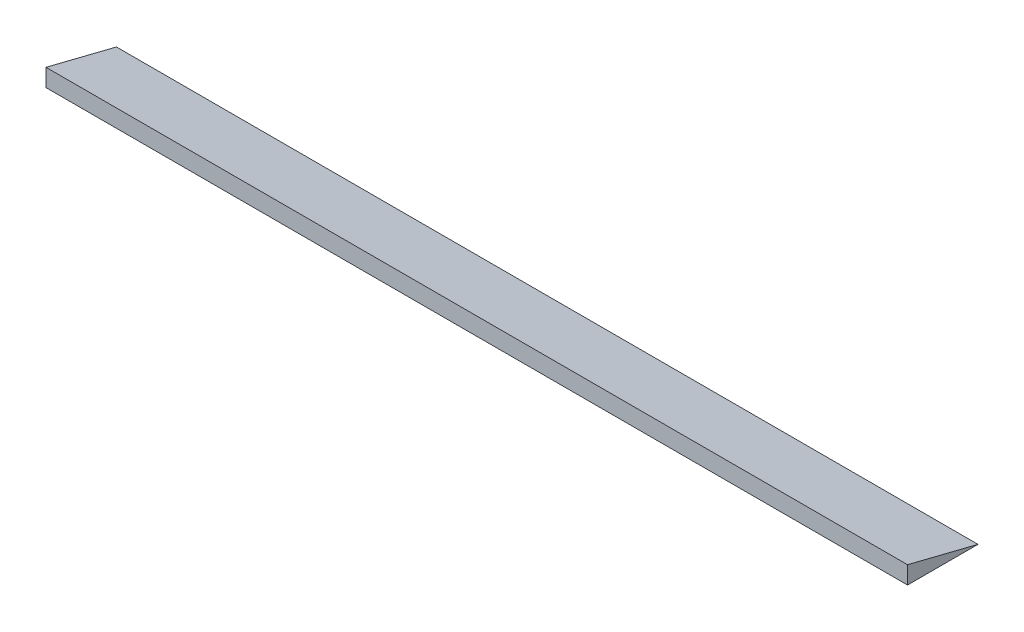
ISO-10303-21;
HEADER;
FILE_DESCRIPTION(('STEP AP214'),'2;1');
FILE_NAME('part.step','',(''),(''),'','','');
FILE_SCHEMA(('AUTOMOTIVE_DESIGN { 1 0 10303 214 1 1 1 1 }'));
ENDSEC;
DATA;
#1=APPLICATION_CONTEXT('core data for automotive mechanical design processes');
#2=APPLICATION_PROTOCOL_DEFINITION('international standard','automotive_design',2000,#1);
#3=PRODUCT_CONTEXT('',#1,'mechanical');
#4=PRODUCT('Part','Part','',(#3));
#5=PRODUCT_RELATED_PRODUCT_CATEGORY('part','',(#4));
#6=PRODUCT_DEFINITION_FORMATION('','',#4);
#7=PRODUCT_DEFINITION_CONTEXT('part definition',#1,'design');
#8=PRODUCT_DEFINITION('design','',#6,#7);
#9=PRODUCT_DEFINITION_SHAPE('','',#8);
#10=(LENGTH_UNIT() NAMED_UNIT(*) SI_UNIT(.MILLI.,.METRE.));
#11=(NAMED_UNIT(*) PLANE_ANGLE_UNIT() SI_UNIT($,.RADIAN.));
#12=(NAMED_UNIT(*) SI_UNIT($,.STERADIAN.) SOLID_ANGLE_UNIT());
#13=UNCERTAINTY_MEASURE_WITH_UNIT(LENGTH_MEASURE(1.E-05),#10,'distance_accuracy_value','');
#14=(GEOMETRIC_REPRESENTATION_CONTEXT(3) GLOBAL_UNCERTAINTY_ASSIGNED_CONTEXT((#13)) GLOBAL_UNIT_ASSIGNED_CONTEXT((#10,
#11,#12)) REPRESENTATION_CONTEXT('',''));
#15=CARTESIAN_POINT('',(0.,0.,0.));
#16=DIRECTION('',(0.,0.,1.));
#17=DIRECTION('',(1.,0.,0.));
#18=AXIS2_PLACEMENT_3D('',#15,#16,#17);
#19=CARTESIAN_POINT('',(310.5,-12.7,-50.8));
#20=DIRECTION('',(0.,-0.970142500145332,0.242535625036333));
#21=DIRECTION('',(0.,-0.242535625036333,-0.970142500145332));
#22=AXIS2_PLACEMENT_3D('',#19,#20,#21);
#23=PLANE('',#22);
#24=DIRECTION('',(0.,0.242535625036333,0.970142500145332));
#25=VECTOR('',#24,1.);
#26=CARTESIAN_POINT('',(-310.5,-12.7,-50.8));
#27=LINE('',#26,#25);
#28=CARTESIAN_POINT('',(-310.5,-12.7,-50.8));
#29=VERTEX_POINT('',#28);
#30=CARTESIAN_POINT('',(-310.5,0.,0.));
#31=VERTEX_POINT('',#30);
#32=EDGE_CURVE('E88',#29,#31,#27,.T.);
#33=ORIENTED_EDGE('',*,*,#32,.T.);
#34=DIRECTION('',(-1.,0.,0.));
#35=VECTOR('',#34,1.);
#36=CARTESIAN_POINT('',(310.5,0.,0.));
#37=LINE('',#36,#35);
#38=CARTESIAN_POINT('',(310.5,0.,0.));
#39=VERTEX_POINT('',#38);
#40=EDGE_CURVE('E11',#39,#31,#37,.T.);
#41=ORIENTED_EDGE('',*,*,#40,.F.);
#42=DIRECTION('',(0.,0.242535625036333,0.970142500145332));
#43=VECTOR('',#42,1.);
#44=CARTESIAN_POINT('',(310.5,-12.7,-50.8));
#45=LINE('',#44,#43);
#46=CARTESIAN_POINT('',(310.5,-12.7,-50.8));
#47=VERTEX_POINT('',#46);
#48=EDGE_CURVE('E76',#47,#39,#45,.T.);
#49=ORIENTED_EDGE('',*,*,#48,.F.);
#50=DIRECTION('',(-1.,0.,0.));
#51=VECTOR('',#50,1.);
#52=CARTESIAN_POINT('',(310.5,-12.7,-50.8));
#53=LINE('',#52,#51);
#54=EDGE_CURVE('E87',#47,#29,#53,.T.);
#55=ORIENTED_EDGE('',*,*,#54,.T.);
#56=EDGE_LOOP('',(#33,#41,#49,#55));
#57=FACE_BOUND('',#56,.T.);
#58=ADVANCED_FACE('F39',(#57),#23,.F.);
#59=CARTESIAN_POINT('',(310.5,0.,0.));
#60=DIRECTION('',(0.,0.,-1.));
#61=DIRECTION('',(0.,1.,0.));
#62=AXIS2_PLACEMENT_3D('',#59,#60,#61);
#63=PLANE('',#62);
#64=DIRECTION('',(0.,-1.,0.));
#65=VECTOR('',#64,1.);
#66=CARTESIAN_POINT('',(-310.5,0.,0.));
#67=LINE('',#66,#65);
#68=CARTESIAN_POINT('',(-310.5,-12.7,0.));
#69=VERTEX_POINT('',#68);
#70=EDGE_CURVE('E69',#31,#69,#67,.T.);
#71=ORIENTED_EDGE('',*,*,#70,.T.);
#72=DIRECTION('',(-1.,0.,0.));
#73=VECTOR('',#72,1.);
#74=CARTESIAN_POINT('',(310.5,-12.7,0.));
#75=LINE('',#74,#73);
#76=CARTESIAN_POINT('',(310.5,-12.7,0.));
#77=VERTEX_POINT('',#76);
#78=EDGE_CURVE('E50',#77,#69,#75,.T.);
#79=ORIENTED_EDGE('',*,*,#78,.F.);
#80=DIRECTION('',(0.,-1.,0.));
#81=VECTOR('',#80,1.);
#82=CARTESIAN_POINT('',(310.5,0.,0.));
#83=LINE('',#82,#81);
#84=EDGE_CURVE('E73',#39,#77,#83,.T.);
#85=ORIENTED_EDGE('',*,*,#84,.F.);
#86=ORIENTED_EDGE('',*,*,#40,.T.);
#87=EDGE_LOOP('',(#71,#79,#85,#86));
#88=FACE_BOUND('',#87,.T.);
#89=ADVANCED_FACE('F77',(#88),#63,.F.);
#90=CARTESIAN_POINT('',(310.5,-12.7,0.));
#91=DIRECTION('',(0.,1.,0.));
#92=DIRECTION('',(0.,0.,1.));
#93=AXIS2_PLACEMENT_3D('',#90,#91,#92);
#94=PLANE('',#93);
#95=DIRECTION('',(0.,0.,-1.));
#96=VECTOR('',#95,1.);
#97=CARTESIAN_POINT('',(-310.5,-12.7,0.));
#98=LINE('',#97,#96);
#99=EDGE_CURVE('E75',#69,#29,#98,.T.);
#100=ORIENTED_EDGE('',*,*,#99,.T.);
#101=ORIENTED_EDGE('',*,*,#54,.F.);
#102=DIRECTION('',(0.,0.,-1.));
#103=VECTOR('',#102,1.);
#104=CARTESIAN_POINT('',(310.5,-12.7,0.));
#105=LINE('',#104,#103);
#106=EDGE_CURVE('E54',#77,#47,#105,.T.);
#107=ORIENTED_EDGE('',*,*,#106,.F.);
#108=ORIENTED_EDGE('',*,*,#78,.T.);
#109=EDGE_LOOP('',(#100,#101,#107,#108));
#110=FACE_BOUND('',#109,.T.);
#111=ADVANCED_FACE('F94',(#110),#94,.F.);
#112=CARTESIAN_POINT('',(310.5,0.,0.));
#113=DIRECTION('',(1.,0.,0.));
#114=DIRECTION('',(0.,0.,-1.));
#115=AXIS2_PLACEMENT_3D('',#112,#113,#114);
#116=PLANE('',#115);
#117=ORIENTED_EDGE('',*,*,#48,.T.);
#118=ORIENTED_EDGE('',*,*,#84,.T.);
#119=ORIENTED_EDGE('',*,*,#106,.T.);
#120=EDGE_LOOP('',(#117,#118,#119));
#121=FACE_BOUND('',#120,.T.);
#122=ADVANCED_FACE('F84',(#121),#116,.T.);
#123=CARTESIAN_POINT('',(-310.5,0.,0.));
#124=DIRECTION('',(1.,0.,0.));
#125=DIRECTION('',(0.,0.,-1.));
#126=AXIS2_PLACEMENT_3D('',#123,#124,#125);
#127=PLANE('',#126);
#128=ORIENTED_EDGE('',*,*,#32,.F.);
#129=ORIENTED_EDGE('',*,*,#99,.F.);
#130=ORIENTED_EDGE('',*,*,#70,.F.);
#131=EDGE_LOOP('',(#128,#129,#130));
#132=FACE_BOUND('',#131,.T.);
#133=ADVANCED_FACE('F92',(#132),#127,.F.);
#134=CLOSED_SHELL('',(#58,#89,#111,#122,#133));
#135=MANIFOLD_SOLID_BREP('B2',#134);
#136=ADVANCED_BREP_SHAPE_REPRESENTATION('',(#18,#135),#14);
#137=SHAPE_DEFINITION_REPRESENTATION(#9,#136);
ENDSEC;
END-ISO-10303-21;
